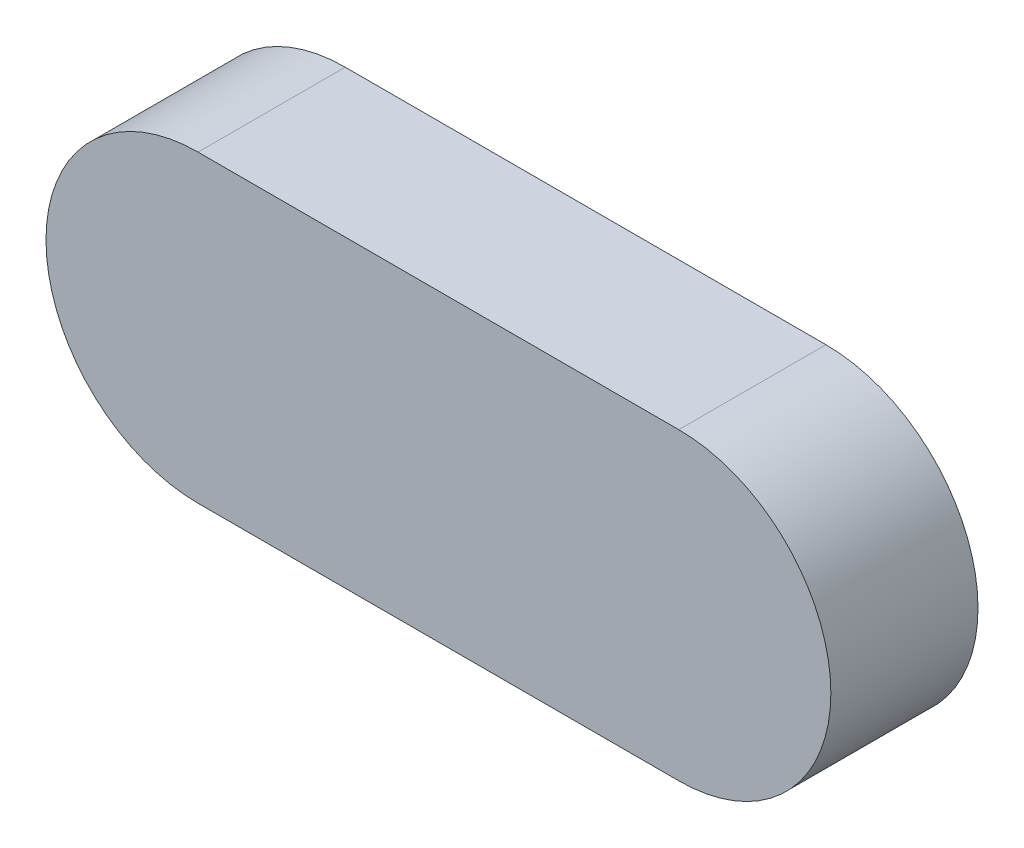
ISO-10303-21;
HEADER;
FILE_DESCRIPTION(('STEP AP214'),'2;1');
FILE_NAME('part.step','',(''),(''),'','','');
FILE_SCHEMA(('AUTOMOTIVE_DESIGN { 1 0 10303 214 1 1 1 1 }'));
ENDSEC;
DATA;
#1=APPLICATION_CONTEXT('core data for automotive mechanical design processes');
#2=APPLICATION_PROTOCOL_DEFINITION('international standard','automotive_design',2000,#1);
#3=PRODUCT_CONTEXT('',#1,'mechanical');
#4=PRODUCT('Part','Part','',(#3));
#5=PRODUCT_RELATED_PRODUCT_CATEGORY('part','',(#4));
#6=PRODUCT_DEFINITION_FORMATION('','',#4);
#7=PRODUCT_DEFINITION_CONTEXT('part definition',#1,'design');
#8=PRODUCT_DEFINITION('design','',#6,#7);
#9=PRODUCT_DEFINITION_SHAPE('','',#8);
#10=(LENGTH_UNIT() NAMED_UNIT(*) SI_UNIT(.MILLI.,.METRE.));
#11=(NAMED_UNIT(*) PLANE_ANGLE_UNIT() SI_UNIT($,.RADIAN.));
#12=(NAMED_UNIT(*) SI_UNIT($,.STERADIAN.) SOLID_ANGLE_UNIT());
#13=UNCERTAINTY_MEASURE_WITH_UNIT(LENGTH_MEASURE(1.E-05),#10,'distance_accuracy_value','');
#14=(GEOMETRIC_REPRESENTATION_CONTEXT(3) GLOBAL_UNCERTAINTY_ASSIGNED_CONTEXT((#13)) GLOBAL_UNIT_ASSIGNED_CONTEXT((#10,
#11,#12)) REPRESENTATION_CONTEXT('',''));
#15=CARTESIAN_POINT('',(0.,0.,0.));
#16=DIRECTION('',(0.,0.,1.));
#17=DIRECTION('',(1.,0.,0.));
#18=AXIS2_PLACEMENT_3D('',#15,#16,#17);
#19=CARTESIAN_POINT('',(0.,0.,7.5));
#20=DIRECTION('',(0.,0.,-1.));
#21=DIRECTION('',(-1.,0.,0.));
#22=AXIS2_PLACEMENT_3D('',#19,#20,#21);
#23=CYLINDRICAL_SURFACE('',#22,7.75);
#24=CARTESIAN_POINT('',(0.,0.,0.));
#25=DIRECTION('',(0.,0.,1.));
#26=DIRECTION('',(1.,0.,0.));
#27=AXIS2_PLACEMENT_3D('',#24,#25,#26);
#28=CIRCLE('',#27,7.75);
#29=CARTESIAN_POINT('',(0.,7.75,0.));
#30=VERTEX_POINT('',#29);
#31=CARTESIAN_POINT('',(0.,-7.75,0.));
#32=VERTEX_POINT('',#31);
#33=EDGE_CURVE('E113',#30,#32,#28,.T.);
#34=ORIENTED_EDGE('',*,*,#33,.T.);
#35=DIRECTION('',(0.,0.,-1.));
#36=VECTOR('',#35,1.);
#37=CARTESIAN_POINT('',(0.,-7.75,7.5));
#38=LINE('',#37,#36);
#39=CARTESIAN_POINT('',(0.,-7.75,7.5));
#40=VERTEX_POINT('',#39);
#41=EDGE_CURVE('E11',#40,#32,#38,.T.);
#42=ORIENTED_EDGE('',*,*,#41,.F.);
#43=CARTESIAN_POINT('',(0.,0.,7.5));
#44=DIRECTION('',(0.,0.,1.));
#45=DIRECTION('',(1.,0.,0.));
#46=AXIS2_PLACEMENT_3D('',#43,#44,#45);
#47=CIRCLE('',#46,7.75);
#48=CARTESIAN_POINT('',(0.,7.75,7.5));
#49=VERTEX_POINT('',#48);
#50=EDGE_CURVE('E97',#49,#40,#47,.T.);
#51=ORIENTED_EDGE('',*,*,#50,.F.);
#52=DIRECTION('',(0.,0.,-1.));
#53=VECTOR('',#52,1.);
#54=CARTESIAN_POINT('',(0.,7.75,7.5));
#55=LINE('',#54,#53);
#56=EDGE_CURVE('E109',#49,#30,#55,.T.);
#57=ORIENTED_EDGE('',*,*,#56,.T.);
#58=EDGE_LOOP('',(#34,#42,#51,#57));
#59=FACE_BOUND('',#58,.T.);
#60=ADVANCED_FACE('F45',(#59),#23,.T.);
#61=CARTESIAN_POINT('',(0.,-7.75,7.5));
#62=DIRECTION('',(0.,1.,0.));
#63=DIRECTION('',(0.,0.,1.));
#64=AXIS2_PLACEMENT_3D('',#61,#62,#63);
#65=PLANE('',#64);
#66=DIRECTION('',(1.,0.,0.));
#67=VECTOR('',#66,1.);
#68=CARTESIAN_POINT('',(0.,-7.75,0.));
#69=LINE('',#68,#67);
#70=CARTESIAN_POINT('',(24.5,-7.75,0.));
#71=VERTEX_POINT('',#70);
#72=EDGE_CURVE('E102',#32,#71,#69,.T.);
#73=ORIENTED_EDGE('',*,*,#72,.T.);
#74=DIRECTION('',(0.,0.,-1.));
#75=VECTOR('',#74,1.);
#76=CARTESIAN_POINT('',(24.5,-7.75,7.5));
#77=LINE('',#76,#75);
#78=CARTESIAN_POINT('',(24.5,-7.75,7.5));
#79=VERTEX_POINT('',#78);
#80=EDGE_CURVE('E54',#79,#71,#77,.T.);
#81=ORIENTED_EDGE('',*,*,#80,.F.);
#82=DIRECTION('',(1.,0.,0.));
#83=VECTOR('',#82,1.);
#84=CARTESIAN_POINT('',(0.,-7.75,7.5));
#85=LINE('',#84,#83);
#86=EDGE_CURVE('E92',#40,#79,#85,.T.);
#87=ORIENTED_EDGE('',*,*,#86,.F.);
#88=ORIENTED_EDGE('',*,*,#41,.T.);
#89=EDGE_LOOP('',(#73,#81,#87,#88));
#90=FACE_BOUND('',#89,.T.);
#91=ADVANCED_FACE('F101',(#90),#65,.F.);
#92=CARTESIAN_POINT('',(24.5,0.,7.5));
#93=DIRECTION('',(0.,0.,-1.));
#94=DIRECTION('',(-1.,0.,0.));
#95=AXIS2_PLACEMENT_3D('',#92,#93,#94);
#96=CYLINDRICAL_SURFACE('',#95,7.75);
#97=CARTESIAN_POINT('',(24.5,0.,0.));
#98=DIRECTION('',(0.,0.,1.));
#99=DIRECTION('',(1.,0.,0.));
#100=AXIS2_PLACEMENT_3D('',#97,#98,#99);
#101=CIRCLE('',#100,7.75);
#102=CARTESIAN_POINT('',(24.5,7.75,0.));
#103=VERTEX_POINT('',#102);
#104=EDGE_CURVE('E79',#71,#103,#101,.T.);
#105=ORIENTED_EDGE('',*,*,#104,.T.);
#106=DIRECTION('',(0.,0.,-1.));
#107=VECTOR('',#106,1.);
#108=CARTESIAN_POINT('',(24.5,7.75,7.5));
#109=LINE('',#108,#107);
#110=CARTESIAN_POINT('',(24.5,7.75,7.5));
#111=VERTEX_POINT('',#110);
#112=EDGE_CURVE('E104',#111,#103,#109,.T.);
#113=ORIENTED_EDGE('',*,*,#112,.F.);
#114=CARTESIAN_POINT('',(24.5,0.,7.5));
#115=DIRECTION('',(0.,0.,1.));
#116=DIRECTION('',(1.,0.,0.));
#117=AXIS2_PLACEMENT_3D('',#114,#115,#116);
#118=CIRCLE('',#117,7.75);
#119=EDGE_CURVE('E95',#79,#111,#118,.T.);
#120=ORIENTED_EDGE('',*,*,#119,.F.);
#121=ORIENTED_EDGE('',*,*,#80,.T.);
#122=EDGE_LOOP('',(#105,#113,#120,#121));
#123=FACE_BOUND('',#122,.T.);
#124=ADVANCED_FACE('F105',(#123),#96,.T.);
#125=CARTESIAN_POINT('',(0.,7.75,7.5));
#126=DIRECTION('',(0.,-1.,0.));
#127=DIRECTION('',(0.,0.,-1.));
#128=AXIS2_PLACEMENT_3D('',#125,#126,#127);
#129=PLANE('',#128);
#130=DIRECTION('',(-1.,0.,0.));
#131=VECTOR('',#130,1.);
#132=CARTESIAN_POINT('',(0.,7.75,0.));
#133=LINE('',#132,#131);
#134=EDGE_CURVE('E85',#103,#30,#133,.T.);
#135=ORIENTED_EDGE('',*,*,#134,.T.);
#136=ORIENTED_EDGE('',*,*,#56,.F.);
#137=DIRECTION('',(-1.,0.,0.));
#138=VECTOR('',#137,1.);
#139=CARTESIAN_POINT('',(0.,7.75,7.5));
#140=LINE('',#139,#138);
#141=EDGE_CURVE('E62',#111,#49,#140,.T.);
#142=ORIENTED_EDGE('',*,*,#141,.F.);
#143=ORIENTED_EDGE('',*,*,#112,.T.);
#144=EDGE_LOOP('',(#135,#136,#142,#143));
#145=FACE_BOUND('',#144,.T.);
#146=ADVANCED_FACE('F126',(#145),#129,.F.);
#147=CARTESIAN_POINT('',(0.,0.,7.5));
#148=DIRECTION('',(0.,0.,1.));
#149=DIRECTION('',(1.,0.,0.));
#150=AXIS2_PLACEMENT_3D('',#147,#148,#149);
#151=PLANE('',#150);
#152=ORIENTED_EDGE('',*,*,#50,.T.);
#153=ORIENTED_EDGE('',*,*,#86,.T.);
#154=ORIENTED_EDGE('',*,*,#119,.T.);
#155=ORIENTED_EDGE('',*,*,#141,.T.);
#156=EDGE_LOOP('',(#152,#153,#154,#155));
#157=FACE_BOUND('',#156,.T.);
#158=ADVANCED_FACE('F93',(#157),#151,.T.);
#159=CARTESIAN_POINT('',(0.,0.,0.));
#160=DIRECTION('',(0.,0.,1.));
#161=DIRECTION('',(1.,0.,0.));
#162=AXIS2_PLACEMENT_3D('',#159,#160,#161);
#163=PLANE('',#162);
#164=ORIENTED_EDGE('',*,*,#33,.F.);
#165=ORIENTED_EDGE('',*,*,#134,.F.);
#166=ORIENTED_EDGE('',*,*,#104,.F.);
#167=ORIENTED_EDGE('',*,*,#72,.F.);
#168=EDGE_LOOP('',(#164,#165,#166,#167));
#169=FACE_BOUND('',#168,.T.);
#170=ADVANCED_FACE('F129',(#169),#163,.F.);
#171=CLOSED_SHELL('',(#60,#91,#124,#146,#158,#170));
#172=MANIFOLD_SOLID_BREP('B2',#171);
#173=ADVANCED_BREP_SHAPE_REPRESENTATION('',(#18,#172),#14);
#174=SHAPE_DEFINITION_REPRESENTATION(#9,#173);
ENDSEC;
END-ISO-10303-21;
